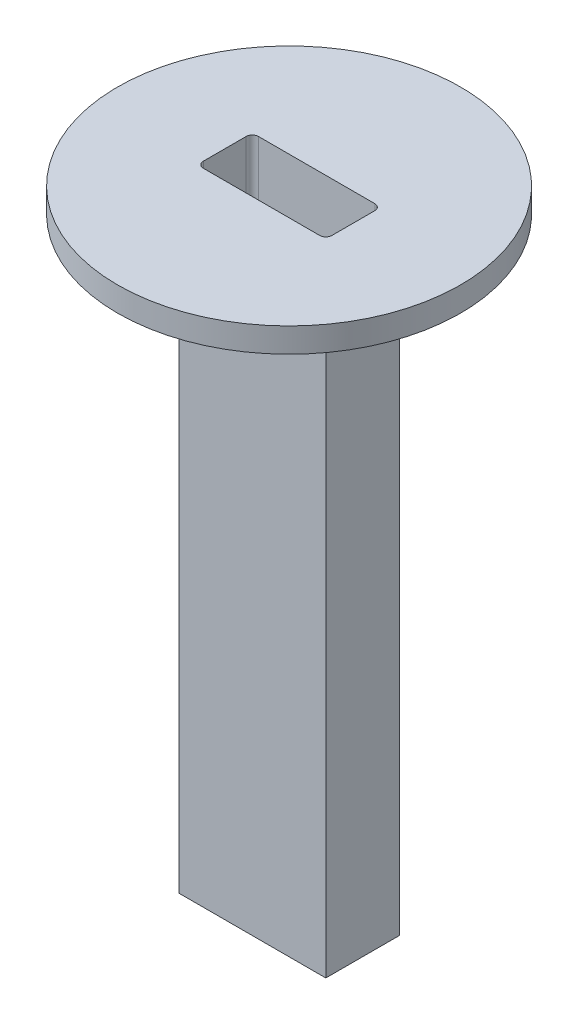
ISO-10303-21;
HEADER;
FILE_DESCRIPTION(('STEP AP214'),'2;1');
FILE_NAME('part.step','',(''),(''),'','','');
FILE_SCHEMA(('AUTOMOTIVE_DESIGN { 1 0 10303 214 1 1 1 1 }'));
ENDSEC;
DATA;
#1=APPLICATION_CONTEXT('core data for automotive mechanical design processes');
#2=APPLICATION_PROTOCOL_DEFINITION('international standard','automotive_design',2000,#1);
#3=PRODUCT_CONTEXT('',#1,'mechanical');
#4=PRODUCT('Part','Part','',(#3));
#5=PRODUCT_RELATED_PRODUCT_CATEGORY('part','',(#4));
#6=PRODUCT_DEFINITION_FORMATION('','',#4);
#7=PRODUCT_DEFINITION_CONTEXT('part definition',#1,'design');
#8=PRODUCT_DEFINITION('design','',#6,#7);
#9=PRODUCT_DEFINITION_SHAPE('','',#8);
#10=(LENGTH_UNIT() NAMED_UNIT(*) SI_UNIT(.MILLI.,.METRE.));
#11=(NAMED_UNIT(*) PLANE_ANGLE_UNIT() SI_UNIT($,.RADIAN.));
#12=(NAMED_UNIT(*) SI_UNIT($,.STERADIAN.) SOLID_ANGLE_UNIT());
#13=UNCERTAINTY_MEASURE_WITH_UNIT(LENGTH_MEASURE(1.E-05),#10,'distance_accuracy_value','');
#14=(GEOMETRIC_REPRESENTATION_CONTEXT(3) GLOBAL_UNCERTAINTY_ASSIGNED_CONTEXT((#13)) GLOBAL_UNIT_ASSIGNED_CONTEXT((#10,
#11,#12)) REPRESENTATION_CONTEXT('',''));
#15=CARTESIAN_POINT('',(0.,0.,0.));
#16=DIRECTION('',(0.,0.,1.));
#17=DIRECTION('',(1.,0.,0.));
#18=AXIS2_PLACEMENT_3D('',#15,#16,#17);
#19=CARTESIAN_POINT('',(0.,0.,0.));
#20=DIRECTION('',(0.,1.,0.));
#21=DIRECTION('',(0.,0.,1.));
#22=AXIS2_PLACEMENT_3D('',#19,#20,#21);
#23=PLANE('',#22);
#24=CARTESIAN_POINT('',(0.,0.,0.));
#25=DIRECTION('',(0.,1.,0.));
#26=DIRECTION('',(0.,0.,1.));
#27=AXIS2_PLACEMENT_3D('',#24,#25,#26);
#28=CIRCLE('',#27,88.9);
#29=CARTESIAN_POINT('',(0.,0.,88.9));
#30=VERTEX_POINT('',#29);
#31=EDGE_CURVE('E39',#30,#30,#28,.T.);
#32=ORIENTED_EDGE('',*,*,#31,.F.);
#33=EDGE_LOOP('',(#32));
#34=FACE_BOUND('',#33,.T.);
#35=DIRECTION('',(0.,0.,-1.));
#36=VECTOR('',#35,1.);
#37=CARTESIAN_POINT('',(-38.1,0.,19.05));
#38=LINE('',#37,#36);
#39=CARTESIAN_POINT('',(-38.1,0.,19.05));
#40=VERTEX_POINT('',#39);
#41=CARTESIAN_POINT('',(-38.1,0.,-19.05));
#42=VERTEX_POINT('',#41);
#43=EDGE_CURVE('E183',#40,#42,#38,.T.);
#44=ORIENTED_EDGE('',*,*,#43,.F.);
#45=DIRECTION('',(-1.,0.,0.));
#46=VECTOR('',#45,1.);
#47=CARTESIAN_POINT('',(-38.1,0.,19.05));
#48=LINE('',#47,#46);
#49=CARTESIAN_POINT('',(38.1,0.,19.05));
#50=VERTEX_POINT('',#49);
#51=EDGE_CURVE('E199',#50,#40,#48,.T.);
#52=ORIENTED_EDGE('',*,*,#51,.F.);
#53=DIRECTION('',(0.,0.,1.));
#54=VECTOR('',#53,1.);
#55=CARTESIAN_POINT('',(38.1,0.,19.05));
#56=LINE('',#55,#54);
#57=CARTESIAN_POINT('',(38.1,0.,-19.05));
#58=VERTEX_POINT('',#57);
#59=EDGE_CURVE('E209',#58,#50,#56,.T.);
#60=ORIENTED_EDGE('',*,*,#59,.F.);
#61=DIRECTION('',(1.,0.,0.));
#62=VECTOR('',#61,1.);
#63=CARTESIAN_POINT('',(-38.1,0.,-19.05));
#64=LINE('',#63,#62);
#65=EDGE_CURVE('E58',#42,#58,#64,.T.);
#66=ORIENTED_EDGE('',*,*,#65,.F.);
#67=EDGE_LOOP('',(#44,#52,#60,#66));
#68=FACE_BOUND('',#67,.T.);
#69=ADVANCED_FACE('F35',(#34,#68),#23,.F.);
#70=CARTESIAN_POINT('',(0.,12.7,0.));
#71=DIRECTION('',(0.,-1.,0.));
#72=DIRECTION('',(0.,0.,-1.));
#73=AXIS2_PLACEMENT_3D('',#70,#71,#72);
#74=CYLINDRICAL_SURFACE('',#73,88.9);
#75=CARTESIAN_POINT('',(0.,12.7,0.));
#76=DIRECTION('',(0.,1.,0.));
#77=DIRECTION('',(0.,0.,1.));
#78=AXIS2_PLACEMENT_3D('',#75,#76,#77);
#79=CIRCLE('',#78,88.9);
#80=CARTESIAN_POINT('',(0.,12.7,88.9));
#81=VERTEX_POINT('',#80);
#82=EDGE_CURVE('E11',#81,#81,#79,.T.);
#83=ORIENTED_EDGE('',*,*,#82,.F.);
#84=EDGE_LOOP('',(#83));
#85=FACE_BOUND('',#84,.T.);
#86=ORIENTED_EDGE('',*,*,#31,.T.);
#87=EDGE_LOOP('',(#86));
#88=FACE_BOUND('',#87,.T.);
#89=ADVANCED_FACE('F37',(#85,#88),#74,.T.);
#90=CARTESIAN_POINT('',(0.,12.7,0.));
#91=DIRECTION('',(0.,1.,0.));
#92=DIRECTION('',(0.,0.,1.));
#93=AXIS2_PLACEMENT_3D('',#90,#91,#92);
#94=PLANE('',#93);
#95=CARTESIAN_POINT('',(-30.1625,12.7,-11.1125));
#96=DIRECTION('',(0.,1.,0.));
#97=DIRECTION('',(0.,0.,1.));
#98=AXIS2_PLACEMENT_3D('',#95,#96,#97);
#99=CIRCLE('',#98,3.175);
#100=CARTESIAN_POINT('',(-30.1625,12.7,-14.2875));
#101=VERTEX_POINT('',#100);
#102=CARTESIAN_POINT('',(-33.3375,12.7,-11.1125));
#103=VERTEX_POINT('',#102);
#104=EDGE_CURVE('E50',#101,#103,#99,.T.);
#105=ORIENTED_EDGE('',*,*,#104,.F.);
#106=DIRECTION('',(-1.,0.,0.));
#107=VECTOR('',#106,1.);
#108=CARTESIAN_POINT('',(-30.1625,12.7,-14.2875));
#109=LINE('',#108,#107);
#110=CARTESIAN_POINT('',(30.1625,12.7,-14.2875));
#111=VERTEX_POINT('',#110);
#112=EDGE_CURVE('E145',#111,#101,#109,.T.);
#113=ORIENTED_EDGE('',*,*,#112,.F.);
#114=CARTESIAN_POINT('',(30.1625,12.7,-11.1125));
#115=DIRECTION('',(0.,1.,0.));
#116=DIRECTION('',(0.,0.,1.));
#117=AXIS2_PLACEMENT_3D('',#114,#115,#116);
#118=CIRCLE('',#117,3.175);
#119=CARTESIAN_POINT('',(33.3375,12.7,-11.1125));
#120=VERTEX_POINT('',#119);
#121=EDGE_CURVE('E148',#120,#111,#118,.T.);
#122=ORIENTED_EDGE('',*,*,#121,.F.);
#123=DIRECTION('',(0.,0.,-1.));
#124=VECTOR('',#123,1.);
#125=CARTESIAN_POINT('',(33.3375,12.7,-11.1125));
#126=LINE('',#125,#124);
#127=CARTESIAN_POINT('',(33.3375,12.7,11.1125));
#128=VERTEX_POINT('',#127);
#129=EDGE_CURVE('E176',#128,#120,#126,.T.);
#130=ORIENTED_EDGE('',*,*,#129,.F.);
#131=CARTESIAN_POINT('',(30.1625,12.7,11.1125));
#132=DIRECTION('',(0.,1.,0.));
#133=DIRECTION('',(0.,0.,-1.));
#134=AXIS2_PLACEMENT_3D('',#131,#132,#133);
#135=CIRCLE('',#134,3.175);
#136=CARTESIAN_POINT('',(30.1625,12.7,14.2875));
#137=VERTEX_POINT('',#136);
#138=EDGE_CURVE('E173',#137,#128,#135,.T.);
#139=ORIENTED_EDGE('',*,*,#138,.F.);
#140=DIRECTION('',(1.,0.,0.));
#141=VECTOR('',#140,1.);
#142=CARTESIAN_POINT('',(-30.1625,12.7,14.2875));
#143=LINE('',#142,#141);
#144=CARTESIAN_POINT('',(-30.1625,12.7,14.2875));
#145=VERTEX_POINT('',#144);
#146=EDGE_CURVE('E170',#145,#137,#143,.T.);
#147=ORIENTED_EDGE('',*,*,#146,.F.);
#148=CARTESIAN_POINT('',(-30.1625,12.7,11.1125));
#149=DIRECTION('',(0.,1.,0.));
#150=DIRECTION('',(0.,0.,1.));
#151=AXIS2_PLACEMENT_3D('',#148,#149,#150);
#152=CIRCLE('',#151,3.175);
#153=CARTESIAN_POINT('',(-33.3375,12.7,11.1125));
#154=VERTEX_POINT('',#153);
#155=EDGE_CURVE('E167',#154,#145,#152,.T.);
#156=ORIENTED_EDGE('',*,*,#155,.F.);
#157=DIRECTION('',(0.,0.,1.));
#158=VECTOR('',#157,1.);
#159=CARTESIAN_POINT('',(-33.3375,12.7,-11.1125));
#160=LINE('',#159,#158);
#161=EDGE_CURVE('E165',#103,#154,#160,.T.);
#162=ORIENTED_EDGE('',*,*,#161,.F.);
#163=EDGE_LOOP('',(#105,#113,#122,#130,#139,#147,#156,#162));
#164=FACE_BOUND('',#163,.T.);
#165=ORIENTED_EDGE('',*,*,#82,.T.);
#166=EDGE_LOOP('',(#165));
#167=FACE_BOUND('',#166,.T.);
#168=ADVANCED_FACE('F252',(#164,#167),#94,.T.);
#169=CARTESIAN_POINT('',(-38.1,-314.325,19.05));
#170=DIRECTION('',(1.,0.,0.));
#171=DIRECTION('',(0.,0.,-1.));
#172=AXIS2_PLACEMENT_3D('',#169,#170,#171);
#173=PLANE('',#172);
#174=ORIENTED_EDGE('',*,*,#43,.T.);
#175=DIRECTION('',(0.,1.,0.));
#176=VECTOR('',#175,1.);
#177=CARTESIAN_POINT('',(-38.1,-314.325,-19.05));
#178=LINE('',#177,#176);
#179=CARTESIAN_POINT('',(-38.1,-314.325,-19.05));
#180=VERTEX_POINT('',#179);
#181=EDGE_CURVE('E222',#180,#42,#178,.T.);
#182=ORIENTED_EDGE('',*,*,#181,.F.);
#183=DIRECTION('',(0.,0.,-1.));
#184=VECTOR('',#183,1.);
#185=CARTESIAN_POINT('',(-38.1,-314.325,19.05));
#186=LINE('',#185,#184);
#187=CARTESIAN_POINT('',(-38.1,-314.325,19.05));
#188=VERTEX_POINT('',#187);
#189=EDGE_CURVE('E195',#188,#180,#186,.T.);
#190=ORIENTED_EDGE('',*,*,#189,.F.);
#191=DIRECTION('',(0.,1.,0.));
#192=VECTOR('',#191,1.);
#193=CARTESIAN_POINT('',(-38.1,-314.325,19.05));
#194=LINE('',#193,#192);
#195=EDGE_CURVE('E205',#188,#40,#194,.T.);
#196=ORIENTED_EDGE('',*,*,#195,.T.);
#197=EDGE_LOOP('',(#174,#182,#190,#196));
#198=FACE_BOUND('',#197,.T.);
#199=ADVANCED_FACE('F237',(#198),#173,.F.);
#200=CARTESIAN_POINT('',(-38.1,-314.325,-19.05));
#201=DIRECTION('',(0.,0.,1.));
#202=DIRECTION('',(1.,0.,0.));
#203=AXIS2_PLACEMENT_3D('',#200,#201,#202);
#204=PLANE('',#203);
#205=ORIENTED_EDGE('',*,*,#65,.T.);
#206=DIRECTION('',(0.,1.,0.));
#207=VECTOR('',#206,1.);
#208=CARTESIAN_POINT('',(38.1,-314.325,-19.05));
#209=LINE('',#208,#207);
#210=CARTESIAN_POINT('',(38.1,-314.325,-19.05));
#211=VERTEX_POINT('',#210);
#212=EDGE_CURVE('E219',#211,#58,#209,.T.);
#213=ORIENTED_EDGE('',*,*,#212,.F.);
#214=DIRECTION('',(1.,0.,0.));
#215=VECTOR('',#214,1.);
#216=CARTESIAN_POINT('',(-38.1,-314.325,-19.05));
#217=LINE('',#216,#215);
#218=EDGE_CURVE('E198',#180,#211,#217,.T.);
#219=ORIENTED_EDGE('',*,*,#218,.F.);
#220=ORIENTED_EDGE('',*,*,#181,.T.);
#221=EDGE_LOOP('',(#205,#213,#219,#220));
#222=FACE_BOUND('',#221,.T.);
#223=ADVANCED_FACE('F244',(#222),#204,.F.);
#224=CARTESIAN_POINT('',(38.1,-314.325,19.05));
#225=DIRECTION('',(-1.,0.,0.));
#226=DIRECTION('',(0.,0.,1.));
#227=AXIS2_PLACEMENT_3D('',#224,#225,#226);
#228=PLANE('',#227);
#229=ORIENTED_EDGE('',*,*,#59,.T.);
#230=DIRECTION('',(0.,1.,0.));
#231=VECTOR('',#230,1.);
#232=CARTESIAN_POINT('',(38.1,-314.325,19.05));
#233=LINE('',#232,#231);
#234=CARTESIAN_POINT('',(38.1,-314.325,19.05));
#235=VERTEX_POINT('',#234);
#236=EDGE_CURVE('E216',#235,#50,#233,.T.);
#237=ORIENTED_EDGE('',*,*,#236,.F.);
#238=DIRECTION('',(0.,0.,1.));
#239=VECTOR('',#238,1.);
#240=CARTESIAN_POINT('',(38.1,-314.325,19.05));
#241=LINE('',#240,#239);
#242=EDGE_CURVE('E201',#211,#235,#241,.T.);
#243=ORIENTED_EDGE('',*,*,#242,.F.);
#244=ORIENTED_EDGE('',*,*,#212,.T.);
#245=EDGE_LOOP('',(#229,#237,#243,#244));
#246=FACE_BOUND('',#245,.T.);
#247=ADVANCED_FACE('F243',(#246),#228,.F.);
#248=CARTESIAN_POINT('',(-38.1,-314.325,19.05));
#249=DIRECTION('',(0.,0.,-1.));
#250=DIRECTION('',(-1.,0.,0.));
#251=AXIS2_PLACEMENT_3D('',#248,#249,#250);
#252=PLANE('',#251);
#253=ORIENTED_EDGE('',*,*,#51,.T.);
#254=ORIENTED_EDGE('',*,*,#195,.F.);
#255=DIRECTION('',(-1.,0.,0.));
#256=VECTOR('',#255,1.);
#257=CARTESIAN_POINT('',(-38.1,-314.325,19.05));
#258=LINE('',#257,#256);
#259=EDGE_CURVE('E203',#235,#188,#258,.T.);
#260=ORIENTED_EDGE('',*,*,#259,.F.);
#261=ORIENTED_EDGE('',*,*,#236,.T.);
#262=EDGE_LOOP('',(#253,#254,#260,#261));
#263=FACE_BOUND('',#262,.T.);
#264=ADVANCED_FACE('F233',(#263),#252,.F.);
#265=CARTESIAN_POINT('',(0.,-314.325,0.));
#266=DIRECTION('',(0.,-1.,0.));
#267=DIRECTION('',(0.,0.,-1.));
#268=AXIS2_PLACEMENT_3D('',#265,#266,#267);
#269=PLANE('',#268);
#270=ORIENTED_EDGE('',*,*,#189,.T.);
#271=ORIENTED_EDGE('',*,*,#218,.T.);
#272=ORIENTED_EDGE('',*,*,#242,.T.);
#273=ORIENTED_EDGE('',*,*,#259,.T.);
#274=EDGE_LOOP('',(#270,#271,#272,#273));
#275=FACE_BOUND('',#274,.T.);
#276=ADVANCED_FACE('F239',(#275),#269,.T.);
#277=CARTESIAN_POINT('',(-30.1625,-304.8,-11.1125));
#278=DIRECTION('',(0.,1.,0.));
#279=DIRECTION('',(0.,0.,1.));
#280=AXIS2_PLACEMENT_3D('',#277,#278,#279);
#281=CYLINDRICAL_SURFACE('',#280,3.175);
#282=ORIENTED_EDGE('',*,*,#104,.T.);
#283=DIRECTION('',(0.,1.,0.));
#284=VECTOR('',#283,1.);
#285=CARTESIAN_POINT('',(-33.3375,-304.8,-11.1125));
#286=LINE('',#285,#284);
#287=CARTESIAN_POINT('',(-33.3375,-304.8,-11.1125));
#288=VERTEX_POINT('',#287);
#289=EDGE_CURVE('E122',#288,#103,#286,.T.);
#290=ORIENTED_EDGE('',*,*,#289,.F.);
#291=CARTESIAN_POINT('',(-30.1625,-304.8,-11.1125));
#292=DIRECTION('',(0.,1.,0.));
#293=DIRECTION('',(0.,0.,1.));
#294=AXIS2_PLACEMENT_3D('',#291,#292,#293);
#295=CIRCLE('',#294,3.175);
#296=CARTESIAN_POINT('',(-30.1625,-304.8,-14.2875));
#297=VERTEX_POINT('',#296);
#298=EDGE_CURVE('E126',#297,#288,#295,.T.);
#299=ORIENTED_EDGE('',*,*,#298,.F.);
#300=DIRECTION('',(0.,1.,0.));
#301=VECTOR('',#300,1.);
#302=CARTESIAN_POINT('',(-30.1625,-304.8,-14.2875));
#303=LINE('',#302,#301);
#304=EDGE_CURVE('E181',#297,#101,#303,.T.);
#305=ORIENTED_EDGE('',*,*,#304,.T.);
#306=EDGE_LOOP('',(#282,#290,#299,#305));
#307=FACE_BOUND('',#306,.T.);
#308=ADVANCED_FACE('F124',(#307),#281,.F.);
#309=CARTESIAN_POINT('',(-30.1625,-304.8,-14.2875));
#310=DIRECTION('',(0.,0.,-1.));
#311=DIRECTION('',(-1.,0.,0.));
#312=AXIS2_PLACEMENT_3D('',#309,#310,#311);
#313=PLANE('',#312);
#314=ORIENTED_EDGE('',*,*,#112,.T.);
#315=ORIENTED_EDGE('',*,*,#304,.F.);
#316=DIRECTION('',(-1.,0.,0.));
#317=VECTOR('',#316,1.);
#318=CARTESIAN_POINT('',(-30.1625,-304.8,-14.2875));
#319=LINE('',#318,#317);
#320=CARTESIAN_POINT('',(30.1625,-304.8,-14.2875));
#321=VERTEX_POINT('',#320);
#322=EDGE_CURVE('E132',#321,#297,#319,.T.);
#323=ORIENTED_EDGE('',*,*,#322,.F.);
#324=DIRECTION('',(0.,1.,0.));
#325=VECTOR('',#324,1.);
#326=CARTESIAN_POINT('',(30.1625,-304.8,-14.2875));
#327=LINE('',#326,#325);
#328=EDGE_CURVE('E184',#321,#111,#327,.T.);
#329=ORIENTED_EDGE('',*,*,#328,.T.);
#330=EDGE_LOOP('',(#314,#315,#323,#329));
#331=FACE_BOUND('',#330,.T.);
#332=ADVANCED_FACE('F284',(#331),#313,.F.);
#333=CARTESIAN_POINT('',(30.1625,-304.8,-11.1125));
#334=DIRECTION('',(0.,1.,0.));
#335=DIRECTION('',(0.,0.,1.));
#336=AXIS2_PLACEMENT_3D('',#333,#334,#335);
#337=CYLINDRICAL_SURFACE('',#336,3.175);
#338=ORIENTED_EDGE('',*,*,#121,.T.);
#339=ORIENTED_EDGE('',*,*,#328,.F.);
#340=CARTESIAN_POINT('',(30.1625,-304.8,-11.1125));
#341=DIRECTION('',(0.,1.,0.));
#342=DIRECTION('',(0.,0.,1.));
#343=AXIS2_PLACEMENT_3D('',#340,#341,#342);
#344=CIRCLE('',#343,3.175);
#345=CARTESIAN_POINT('',(33.3375,-304.8,-11.1125));
#346=VERTEX_POINT('',#345);
#347=EDGE_CURVE('E161',#346,#321,#344,.T.);
#348=ORIENTED_EDGE('',*,*,#347,.F.);
#349=DIRECTION('',(0.,1.,0.));
#350=VECTOR('',#349,1.);
#351=CARTESIAN_POINT('',(33.3375,-304.8,-11.1125));
#352=LINE('',#351,#350);
#353=EDGE_CURVE('E186',#346,#120,#352,.T.);
#354=ORIENTED_EDGE('',*,*,#353,.T.);
#355=EDGE_LOOP('',(#338,#339,#348,#354));
#356=FACE_BOUND('',#355,.T.);
#357=ADVANCED_FACE('F285',(#356),#337,.F.);
#358=CARTESIAN_POINT('',(33.3375,-304.8,-11.1125));
#359=DIRECTION('',(1.,0.,0.));
#360=DIRECTION('',(0.,0.,-1.));
#361=AXIS2_PLACEMENT_3D('',#358,#359,#360);
#362=PLANE('',#361);
#363=ORIENTED_EDGE('',*,*,#129,.T.);
#364=ORIENTED_EDGE('',*,*,#353,.F.);
#365=DIRECTION('',(0.,0.,-1.));
#366=VECTOR('',#365,1.);
#367=CARTESIAN_POINT('',(33.3375,-304.8,-11.1125));
#368=LINE('',#367,#366);
#369=CARTESIAN_POINT('',(33.3375,-304.8,11.1125));
#370=VERTEX_POINT('',#369);
#371=EDGE_CURVE('E158',#370,#346,#368,.T.);
#372=ORIENTED_EDGE('',*,*,#371,.F.);
#373=DIRECTION('',(0.,1.,0.));
#374=VECTOR('',#373,1.);
#375=CARTESIAN_POINT('',(33.3375,-304.8,11.1125));
#376=LINE('',#375,#374);
#377=EDGE_CURVE('E188',#370,#128,#376,.T.);
#378=ORIENTED_EDGE('',*,*,#377,.T.);
#379=EDGE_LOOP('',(#363,#364,#372,#378));
#380=FACE_BOUND('',#379,.T.);
#381=ADVANCED_FACE('F280',(#380),#362,.F.);
#382=CARTESIAN_POINT('',(30.1625,-304.8,11.1125));
#383=DIRECTION('',(0.,1.,0.));
#384=DIRECTION('',(0.,0.,1.));
#385=AXIS2_PLACEMENT_3D('',#382,#383,#384);
#386=CYLINDRICAL_SURFACE('',#385,3.175);
#387=ORIENTED_EDGE('',*,*,#138,.T.);
#388=ORIENTED_EDGE('',*,*,#377,.F.);
#389=CARTESIAN_POINT('',(30.1625,-304.8,11.1125));
#390=DIRECTION('',(0.,1.,0.));
#391=DIRECTION('',(0.,0.,-1.));
#392=AXIS2_PLACEMENT_3D('',#389,#390,#391);
#393=CIRCLE('',#392,3.175);
#394=CARTESIAN_POINT('',(30.1625,-304.8,14.2875));
#395=VERTEX_POINT('',#394);
#396=EDGE_CURVE('E155',#395,#370,#393,.T.);
#397=ORIENTED_EDGE('',*,*,#396,.F.);
#398=DIRECTION('',(0.,1.,0.));
#399=VECTOR('',#398,1.);
#400=CARTESIAN_POINT('',(30.1625,-304.8,14.2875));
#401=LINE('',#400,#399);
#402=EDGE_CURVE('E190',#395,#137,#401,.T.);
#403=ORIENTED_EDGE('',*,*,#402,.T.);
#404=EDGE_LOOP('',(#387,#388,#397,#403));
#405=FACE_BOUND('',#404,.T.);
#406=ADVANCED_FACE('F276',(#405),#386,.F.);
#407=CARTESIAN_POINT('',(-30.1625,-304.8,14.2875));
#408=DIRECTION('',(0.,0.,1.));
#409=DIRECTION('',(1.,0.,0.));
#410=AXIS2_PLACEMENT_3D('',#407,#408,#409);
#411=PLANE('',#410);
#412=ORIENTED_EDGE('',*,*,#146,.T.);
#413=ORIENTED_EDGE('',*,*,#402,.F.);
#414=DIRECTION('',(1.,0.,0.));
#415=VECTOR('',#414,1.);
#416=CARTESIAN_POINT('',(-30.1625,-304.8,14.2875));
#417=LINE('',#416,#415);
#418=CARTESIAN_POINT('',(-30.1625,-304.8,14.2875));
#419=VERTEX_POINT('',#418);
#420=EDGE_CURVE('E152',#419,#395,#417,.T.);
#421=ORIENTED_EDGE('',*,*,#420,.F.);
#422=DIRECTION('',(0.,1.,0.));
#423=VECTOR('',#422,1.);
#424=CARTESIAN_POINT('',(-30.1625,-304.8,14.2875));
#425=LINE('',#424,#423);
#426=EDGE_CURVE('E192',#419,#145,#425,.T.);
#427=ORIENTED_EDGE('',*,*,#426,.T.);
#428=EDGE_LOOP('',(#412,#413,#421,#427));
#429=FACE_BOUND('',#428,.T.);
#430=ADVANCED_FACE('F274',(#429),#411,.F.);
#431=CARTESIAN_POINT('',(-30.1625,-304.8,11.1125));
#432=DIRECTION('',(0.,1.,0.));
#433=DIRECTION('',(0.,0.,1.));
#434=AXIS2_PLACEMENT_3D('',#431,#432,#433);
#435=CYLINDRICAL_SURFACE('',#434,3.175);
#436=ORIENTED_EDGE('',*,*,#155,.T.);
#437=ORIENTED_EDGE('',*,*,#426,.F.);
#438=CARTESIAN_POINT('',(-30.1625,-304.8,11.1125));
#439=DIRECTION('',(0.,1.,0.));
#440=DIRECTION('',(0.,0.,1.));
#441=AXIS2_PLACEMENT_3D('',#438,#439,#440);
#442=CIRCLE('',#441,3.175);
#443=CARTESIAN_POINT('',(-33.3375,-304.8,11.1125));
#444=VERTEX_POINT('',#443);
#445=EDGE_CURVE('E140',#444,#419,#442,.T.);
#446=ORIENTED_EDGE('',*,*,#445,.F.);
#447=DIRECTION('',(0.,1.,0.));
#448=VECTOR('',#447,1.);
#449=CARTESIAN_POINT('',(-33.3375,-304.8,11.1125));
#450=LINE('',#449,#448);
#451=EDGE_CURVE('E131',#444,#154,#450,.T.);
#452=ORIENTED_EDGE('',*,*,#451,.T.);
#453=EDGE_LOOP('',(#436,#437,#446,#452));
#454=FACE_BOUND('',#453,.T.);
#455=ADVANCED_FACE('F270',(#454),#435,.F.);
#456=CARTESIAN_POINT('',(-33.3375,-304.8,-11.1125));
#457=DIRECTION('',(-1.,0.,0.));
#458=DIRECTION('',(0.,0.,1.));
#459=AXIS2_PLACEMENT_3D('',#456,#457,#458);
#460=PLANE('',#459);
#461=ORIENTED_EDGE('',*,*,#161,.T.);
#462=ORIENTED_EDGE('',*,*,#451,.F.);
#463=DIRECTION('',(0.,0.,1.));
#464=VECTOR('',#463,1.);
#465=CARTESIAN_POINT('',(-33.3375,-304.8,-11.1125));
#466=LINE('',#465,#464);
#467=EDGE_CURVE('E135',#288,#444,#466,.T.);
#468=ORIENTED_EDGE('',*,*,#467,.F.);
#469=ORIENTED_EDGE('',*,*,#289,.T.);
#470=EDGE_LOOP('',(#461,#462,#468,#469));
#471=FACE_BOUND('',#470,.T.);
#472=ADVANCED_FACE('F136',(#471),#460,.F.);
#473=CARTESIAN_POINT('',(-30.1625,-304.8,-11.1125));
#474=DIRECTION('',(0.,1.,0.));
#475=DIRECTION('',(0.,0.,1.));
#476=AXIS2_PLACEMENT_3D('',#473,#474,#475);
#477=PLANE('',#476);
#478=ORIENTED_EDGE('',*,*,#298,.T.);
#479=ORIENTED_EDGE('',*,*,#467,.T.);
#480=ORIENTED_EDGE('',*,*,#445,.T.);
#481=ORIENTED_EDGE('',*,*,#420,.T.);
#482=ORIENTED_EDGE('',*,*,#396,.T.);
#483=ORIENTED_EDGE('',*,*,#371,.T.);
#484=ORIENTED_EDGE('',*,*,#347,.T.);
#485=ORIENTED_EDGE('',*,*,#322,.T.);
#486=EDGE_LOOP('',(#478,#479,#480,#481,#482,#483,#484,#485));
#487=FACE_BOUND('',#486,.T.);
#488=ADVANCED_FACE('F142',(#487),#477,.T.);
#489=CLOSED_SHELL('',(#69,#89,#168,#199,#223,#247,#264,#276,#308,#332,#357,#381,#406,#430,#455,
#472,#488));
#490=MANIFOLD_SOLID_BREP('B2',#489);
#491=ADVANCED_BREP_SHAPE_REPRESENTATION('',(#18,#490),#14);
#492=SHAPE_DEFINITION_REPRESENTATION(#9,#491);
ENDSEC;
END-ISO-10303-21;
